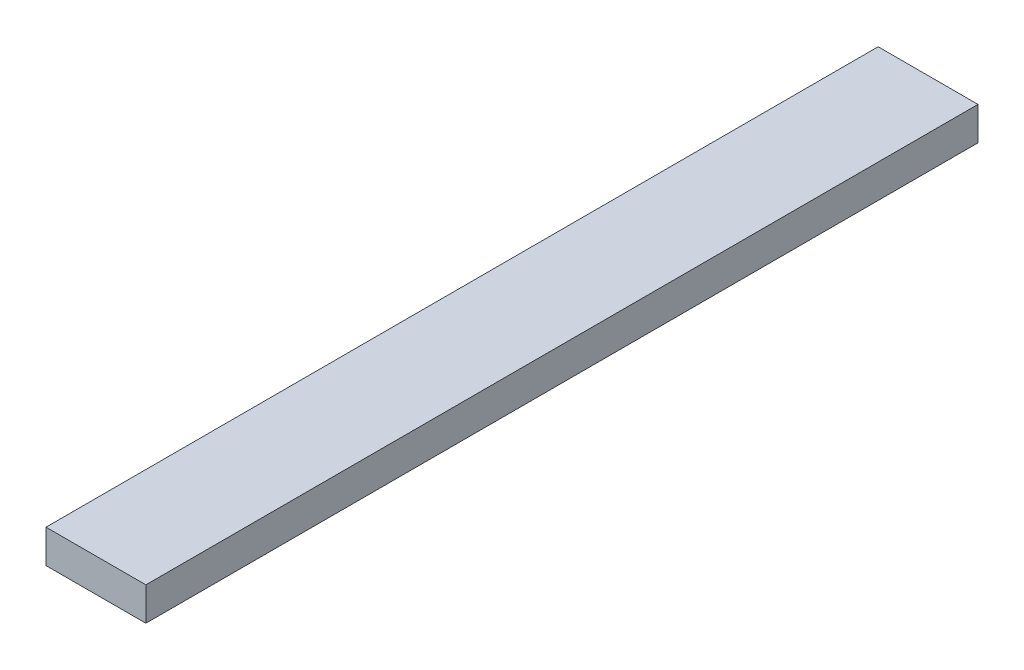
ISO-10303-21;
HEADER;
FILE_DESCRIPTION(('STEP AP214'),'2;1');
FILE_NAME('part.step','',(''),(''),'','','');
FILE_SCHEMA(('AUTOMOTIVE_DESIGN { 1 0 10303 214 1 1 1 1 }'));
ENDSEC;
DATA;
#1=APPLICATION_CONTEXT('core data for automotive mechanical design processes');
#2=APPLICATION_PROTOCOL_DEFINITION('international standard','automotive_design',2000,#1);
#3=PRODUCT_CONTEXT('',#1,'mechanical');
#4=PRODUCT('Part','Part','',(#3));
#5=PRODUCT_RELATED_PRODUCT_CATEGORY('part','',(#4));
#6=PRODUCT_DEFINITION_FORMATION('','',#4);
#7=PRODUCT_DEFINITION_CONTEXT('part definition',#1,'design');
#8=PRODUCT_DEFINITION('design','',#6,#7);
#9=PRODUCT_DEFINITION_SHAPE('','',#8);
#10=(LENGTH_UNIT() NAMED_UNIT(*) SI_UNIT(.MILLI.,.METRE.));
#11=(NAMED_UNIT(*) PLANE_ANGLE_UNIT() SI_UNIT($,.RADIAN.));
#12=(NAMED_UNIT(*) SI_UNIT($,.STERADIAN.) SOLID_ANGLE_UNIT());
#13=UNCERTAINTY_MEASURE_WITH_UNIT(LENGTH_MEASURE(1.E-05),#10,'distance_accuracy_value','');
#14=(GEOMETRIC_REPRESENTATION_CONTEXT(3) GLOBAL_UNCERTAINTY_ASSIGNED_CONTEXT((#13)) GLOBAL_UNIT_ASSIGNED_CONTEXT((#10,
#11,#12)) REPRESENTATION_CONTEXT('',''));
#15=CARTESIAN_POINT('',(0.,0.,0.));
#16=DIRECTION('',(0.,0.,1.));
#17=DIRECTION('',(1.,0.,0.));
#18=AXIS2_PLACEMENT_3D('',#15,#16,#17);
#19=CARTESIAN_POINT('',(30.,10.,-250.));
#20=DIRECTION('',(-1.,0.,0.));
#21=DIRECTION('',(0.,0.,1.));
#22=AXIS2_PLACEMENT_3D('',#19,#20,#21);
#23=PLANE('',#22);
#24=DIRECTION('',(0.,0.,-1.));
#25=VECTOR('',#24,1.);
#26=CARTESIAN_POINT('',(30.,-10.,-250.));
#27=LINE('',#26,#25);
#28=CARTESIAN_POINT('',(30.,-10.,250.));
#29=VERTEX_POINT('',#28);
#30=CARTESIAN_POINT('',(30.,-10.,-250.));
#31=VERTEX_POINT('',#30);
#32=EDGE_CURVE('E107',#29,#31,#27,.T.);
#33=ORIENTED_EDGE('',*,*,#32,.T.);
#34=DIRECTION('',(0.,-1.,0.));
#35=VECTOR('',#34,1.);
#36=CARTESIAN_POINT('',(30.,10.,-250.));
#37=LINE('',#36,#35);
#38=CARTESIAN_POINT('',(30.,10.,-250.));
#39=VERTEX_POINT('',#38);
#40=EDGE_CURVE('E11',#39,#31,#37,.T.);
#41=ORIENTED_EDGE('',*,*,#40,.F.);
#42=DIRECTION('',(0.,0.,-1.));
#43=VECTOR('',#42,1.);
#44=CARTESIAN_POINT('',(30.,10.,-250.));
#45=LINE('',#44,#43);
#46=CARTESIAN_POINT('',(30.,10.,250.));
#47=VERTEX_POINT('',#46);
#48=EDGE_CURVE('E91',#47,#39,#45,.T.);
#49=ORIENTED_EDGE('',*,*,#48,.F.);
#50=DIRECTION('',(0.,-1.,0.));
#51=VECTOR('',#50,1.);
#52=CARTESIAN_POINT('',(30.,10.,250.));
#53=LINE('',#52,#51);
#54=EDGE_CURVE('E103',#47,#29,#53,.T.);
#55=ORIENTED_EDGE('',*,*,#54,.T.);
#56=EDGE_LOOP('',(#33,#41,#49,#55));
#57=FACE_BOUND('',#56,.T.);
#58=ADVANCED_FACE('F39',(#57),#23,.F.);
#59=CARTESIAN_POINT('',(-30.,10.,-250.));
#60=DIRECTION('',(0.,0.,1.));
#61=DIRECTION('',(1.,0.,0.));
#62=AXIS2_PLACEMENT_3D('',#59,#60,#61);
#63=PLANE('',#62);
#64=DIRECTION('',(-1.,0.,0.));
#65=VECTOR('',#64,1.);
#66=CARTESIAN_POINT('',(-30.,-10.,-250.));
#67=LINE('',#66,#65);
#68=CARTESIAN_POINT('',(-30.,-10.,-250.));
#69=VERTEX_POINT('',#68);
#70=EDGE_CURVE('E96',#31,#69,#67,.T.);
#71=ORIENTED_EDGE('',*,*,#70,.T.);
#72=DIRECTION('',(0.,-1.,0.));
#73=VECTOR('',#72,1.);
#74=CARTESIAN_POINT('',(-30.,10.,-250.));
#75=LINE('',#74,#73);
#76=CARTESIAN_POINT('',(-30.,10.,-250.));
#77=VERTEX_POINT('',#76);
#78=EDGE_CURVE('E48',#77,#69,#75,.T.);
#79=ORIENTED_EDGE('',*,*,#78,.F.);
#80=DIRECTION('',(-1.,0.,0.));
#81=VECTOR('',#80,1.);
#82=CARTESIAN_POINT('',(-30.,10.,-250.));
#83=LINE('',#82,#81);
#84=EDGE_CURVE('E86',#39,#77,#83,.T.);
#85=ORIENTED_EDGE('',*,*,#84,.F.);
#86=ORIENTED_EDGE('',*,*,#40,.T.);
#87=EDGE_LOOP('',(#71,#79,#85,#86));
#88=FACE_BOUND('',#87,.T.);
#89=ADVANCED_FACE('F95',(#88),#63,.F.);
#90=CARTESIAN_POINT('',(-30.,10.,-250.));
#91=DIRECTION('',(1.,0.,0.));
#92=DIRECTION('',(0.,0.,-1.));
#93=AXIS2_PLACEMENT_3D('',#90,#91,#92);
#94=PLANE('',#93);
#95=DIRECTION('',(0.,0.,1.));
#96=VECTOR('',#95,1.);
#97=CARTESIAN_POINT('',(-30.,-10.,-250.));
#98=LINE('',#97,#96);
#99=CARTESIAN_POINT('',(-30.,-10.,250.));
#100=VERTEX_POINT('',#99);
#101=EDGE_CURVE('E73',#69,#100,#98,.T.);
#102=ORIENTED_EDGE('',*,*,#101,.T.);
#103=DIRECTION('',(0.,-1.,0.));
#104=VECTOR('',#103,1.);
#105=CARTESIAN_POINT('',(-30.,10.,250.));
#106=LINE('',#105,#104);
#107=CARTESIAN_POINT('',(-30.,10.,250.));
#108=VERTEX_POINT('',#107);
#109=EDGE_CURVE('E98',#108,#100,#106,.T.);
#110=ORIENTED_EDGE('',*,*,#109,.F.);
#111=DIRECTION('',(0.,0.,1.));
#112=VECTOR('',#111,1.);
#113=CARTESIAN_POINT('',(-30.,10.,-250.));
#114=LINE('',#113,#112);
#115=EDGE_CURVE('E89',#77,#108,#114,.T.);
#116=ORIENTED_EDGE('',*,*,#115,.F.);
#117=ORIENTED_EDGE('',*,*,#78,.T.);
#118=EDGE_LOOP('',(#102,#110,#116,#117));
#119=FACE_BOUND('',#118,.T.);
#120=ADVANCED_FACE('F99',(#119),#94,.F.);
#121=CARTESIAN_POINT('',(-30.,10.,250.));
#122=DIRECTION('',(0.,0.,-1.));
#123=DIRECTION('',(-1.,0.,0.));
#124=AXIS2_PLACEMENT_3D('',#121,#122,#123);
#125=PLANE('',#124);
#126=DIRECTION('',(1.,0.,0.));
#127=VECTOR('',#126,1.);
#128=CARTESIAN_POINT('',(-30.,-10.,250.));
#129=LINE('',#128,#127);
#130=EDGE_CURVE('E79',#100,#29,#129,.T.);
#131=ORIENTED_EDGE('',*,*,#130,.T.);
#132=ORIENTED_EDGE('',*,*,#54,.F.);
#133=DIRECTION('',(1.,0.,0.));
#134=VECTOR('',#133,1.);
#135=CARTESIAN_POINT('',(-30.,10.,250.));
#136=LINE('',#135,#134);
#137=EDGE_CURVE('E56',#108,#47,#136,.T.);
#138=ORIENTED_EDGE('',*,*,#137,.F.);
#139=ORIENTED_EDGE('',*,*,#109,.T.);
#140=EDGE_LOOP('',(#131,#132,#138,#139));
#141=FACE_BOUND('',#140,.T.);
#142=ADVANCED_FACE('F120',(#141),#125,.F.);
#143=CARTESIAN_POINT('',(0.,10.,0.));
#144=DIRECTION('',(0.,1.,0.));
#145=DIRECTION('',(0.,0.,1.));
#146=AXIS2_PLACEMENT_3D('',#143,#144,#145);
#147=PLANE('',#146);
#148=ORIENTED_EDGE('',*,*,#48,.T.);
#149=ORIENTED_EDGE('',*,*,#84,.T.);
#150=ORIENTED_EDGE('',*,*,#115,.T.);
#151=ORIENTED_EDGE('',*,*,#137,.T.);
#152=EDGE_LOOP('',(#148,#149,#150,#151));
#153=FACE_BOUND('',#152,.T.);
#154=ADVANCED_FACE('F87',(#153),#147,.T.);
#155=CARTESIAN_POINT('',(0.,-10.,0.));
#156=DIRECTION('',(0.,1.,0.));
#157=DIRECTION('',(0.,0.,1.));
#158=AXIS2_PLACEMENT_3D('',#155,#156,#157);
#159=PLANE('',#158);
#160=ORIENTED_EDGE('',*,*,#32,.F.);
#161=ORIENTED_EDGE('',*,*,#130,.F.);
#162=ORIENTED_EDGE('',*,*,#101,.F.);
#163=ORIENTED_EDGE('',*,*,#70,.F.);
#164=EDGE_LOOP('',(#160,#161,#162,#163));
#165=FACE_BOUND('',#164,.T.);
#166=ADVANCED_FACE('F123',(#165),#159,.F.);
#167=CLOSED_SHELL('',(#58,#89,#120,#142,#154,#166));
#168=MANIFOLD_SOLID_BREP('B2',#167);
#169=ADVANCED_BREP_SHAPE_REPRESENTATION('',(#18,#168),#14);
#170=SHAPE_DEFINITION_REPRESENTATION(#9,#169);
ENDSEC;
END-ISO-10303-21;
